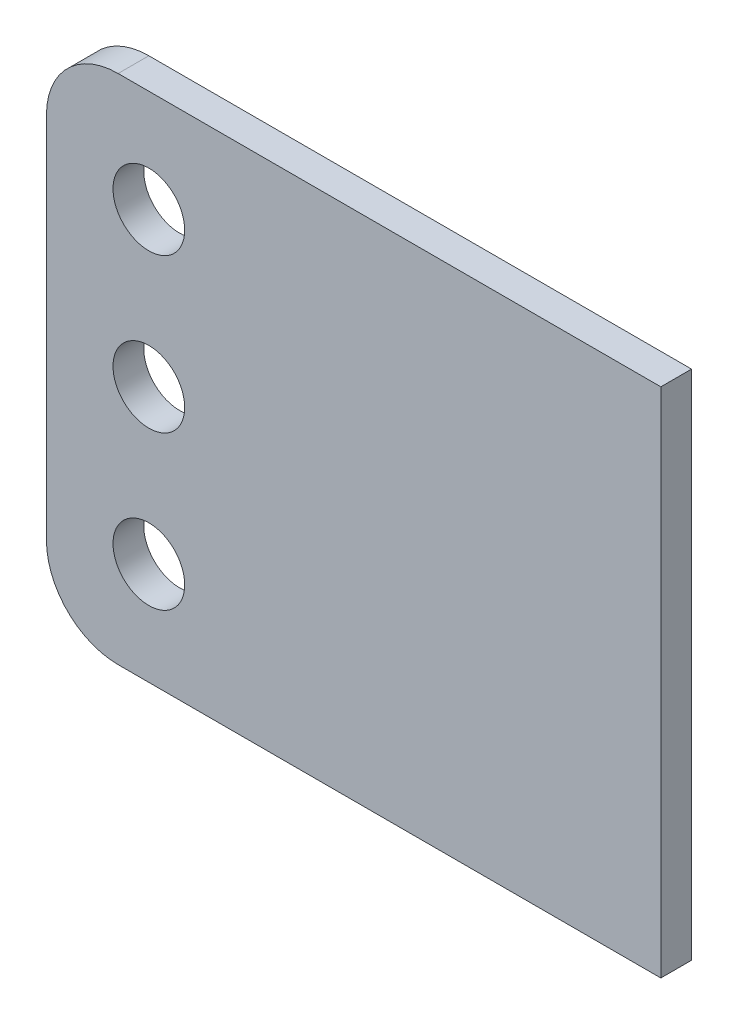
ISO-10303-21;
HEADER;
FILE_DESCRIPTION(('STEP AP214'),'2;1');
FILE_NAME('part.step','',(''),(''),'','','');
FILE_SCHEMA(('AUTOMOTIVE_DESIGN { 1 0 10303 214 1 1 1 1 }'));
ENDSEC;
DATA;
#1=APPLICATION_CONTEXT('core data for automotive mechanical design processes');
#2=APPLICATION_PROTOCOL_DEFINITION('international standard','automotive_design',2000,#1);
#3=PRODUCT_CONTEXT('',#1,'mechanical');
#4=PRODUCT('Part','Part','',(#3));
#5=PRODUCT_RELATED_PRODUCT_CATEGORY('part','',(#4));
#6=PRODUCT_DEFINITION_FORMATION('','',#4);
#7=PRODUCT_DEFINITION_CONTEXT('part definition',#1,'design');
#8=PRODUCT_DEFINITION('design','',#6,#7);
#9=PRODUCT_DEFINITION_SHAPE('','',#8);
#10=(LENGTH_UNIT() NAMED_UNIT(*) SI_UNIT(.MILLI.,.METRE.));
#11=(NAMED_UNIT(*) PLANE_ANGLE_UNIT() SI_UNIT($,.RADIAN.));
#12=(NAMED_UNIT(*) SI_UNIT($,.STERADIAN.) SOLID_ANGLE_UNIT());
#13=UNCERTAINTY_MEASURE_WITH_UNIT(LENGTH_MEASURE(1.E-05),#10,'distance_accuracy_value','');
#14=(GEOMETRIC_REPRESENTATION_CONTEXT(3) GLOBAL_UNCERTAINTY_ASSIGNED_CONTEXT((#13)) GLOBAL_UNIT_ASSIGNED_CONTEXT((#10,
#11,#12)) REPRESENTATION_CONTEXT('',''));
#15=CARTESIAN_POINT('',(0.,0.,0.));
#16=DIRECTION('',(0.,0.,1.));
#17=DIRECTION('',(1.,0.,0.));
#18=AXIS2_PLACEMENT_3D('',#15,#16,#17);
#19=CARTESIAN_POINT('',(0.,0.,3.));
#20=DIRECTION('',(1.,0.,0.));
#21=DIRECTION('',(0.,0.,-1.));
#22=AXIS2_PLACEMENT_3D('',#19,#20,#21);
#23=PLANE('',#22);
#24=DIRECTION('',(0.,-1.,0.));
#25=VECTOR('',#24,1.);
#26=CARTESIAN_POINT('',(0.,0.,0.));
#27=LINE('',#26,#25);
#28=CARTESIAN_POINT('',(0.,43.,0.));
#29=VERTEX_POINT('',#28);
#30=CARTESIAN_POINT('',(0.,7.,0.));
#31=VERTEX_POINT('',#30);
#32=EDGE_CURVE('E126',#29,#31,#27,.T.);
#33=ORIENTED_EDGE('',*,*,#32,.T.);
#34=DIRECTION('',(0.,0.,-1.));
#35=VECTOR('',#34,1.);
#36=CARTESIAN_POINT('',(0.,7.,3.));
#37=LINE('',#36,#35);
#38=CARTESIAN_POINT('',(0.,7.,3.));
#39=VERTEX_POINT('',#38);
#40=EDGE_CURVE('E64',#31,#39,#37,.F.);
#41=ORIENTED_EDGE('',*,*,#40,.T.);
#42=DIRECTION('',(0.,-1.,0.));
#43=VECTOR('',#42,1.);
#44=CARTESIAN_POINT('',(0.,0.,3.));
#45=LINE('',#44,#43);
#46=CARTESIAN_POINT('',(0.,43.,3.));
#47=VERTEX_POINT('',#46);
#48=EDGE_CURVE('E107',#47,#39,#45,.T.);
#49=ORIENTED_EDGE('',*,*,#48,.F.);
#50=DIRECTION('',(0.,0.,-1.));
#51=VECTOR('',#50,1.);
#52=CARTESIAN_POINT('',(0.,43.,3.));
#53=LINE('',#52,#51);
#54=EDGE_CURVE('E140',#47,#29,#53,.T.);
#55=ORIENTED_EDGE('',*,*,#54,.T.);
#56=EDGE_LOOP('',(#33,#41,#49,#55));
#57=FACE_BOUND('',#56,.T.);
#58=ADVANCED_FACE('F43',(#57),#23,.F.);
#59=CARTESIAN_POINT('',(0.,0.,3.));
#60=DIRECTION('',(0.,1.,0.));
#61=DIRECTION('',(0.,0.,1.));
#62=AXIS2_PLACEMENT_3D('',#59,#60,#61);
#63=PLANE('',#62);
#64=DIRECTION('',(1.,0.,0.));
#65=VECTOR('',#64,1.);
#66=CARTESIAN_POINT('',(0.,0.,3.));
#67=LINE('',#66,#65);
#68=CARTESIAN_POINT('',(7.,0.,3.));
#69=VERTEX_POINT('',#68);
#70=CARTESIAN_POINT('',(60.,0.,3.));
#71=VERTEX_POINT('',#70);
#72=EDGE_CURVE('E97',#69,#71,#67,.T.);
#73=ORIENTED_EDGE('',*,*,#72,.F.);
#74=DIRECTION('',(0.,0.,-1.));
#75=VECTOR('',#74,1.);
#76=CARTESIAN_POINT('',(7.,0.,3.));
#77=LINE('',#76,#75);
#78=CARTESIAN_POINT('',(7.,0.,0.));
#79=VERTEX_POINT('',#78);
#80=EDGE_CURVE('E116',#69,#79,#77,.T.);
#81=ORIENTED_EDGE('',*,*,#80,.T.);
#82=DIRECTION('',(1.,0.,0.));
#83=VECTOR('',#82,1.);
#84=CARTESIAN_POINT('',(0.,0.,0.));
#85=LINE('',#84,#83);
#86=CARTESIAN_POINT('',(60.,0.,0.));
#87=VERTEX_POINT('',#86);
#88=EDGE_CURVE('E113',#79,#87,#85,.T.);
#89=ORIENTED_EDGE('',*,*,#88,.T.);
#90=DIRECTION('',(0.,0.,-1.));
#91=VECTOR('',#90,1.);
#92=CARTESIAN_POINT('',(60.,0.,3.));
#93=LINE('',#92,#91);
#94=EDGE_CURVE('E110',#71,#87,#93,.T.);
#95=ORIENTED_EDGE('',*,*,#94,.F.);
#96=EDGE_LOOP('',(#73,#81,#89,#95));
#97=FACE_BOUND('',#96,.T.);
#98=ADVANCED_FACE('F111',(#97),#63,.F.);
#99=CARTESIAN_POINT('',(60.,0.,3.));
#100=DIRECTION('',(-1.,0.,0.));
#101=DIRECTION('',(0.,-1.,0.));
#102=AXIS2_PLACEMENT_3D('',#99,#100,#101);
#103=PLANE('',#102);
#104=DIRECTION('',(0.,1.,0.));
#105=VECTOR('',#104,1.);
#106=CARTESIAN_POINT('',(60.,0.,0.));
#107=LINE('',#106,#105);
#108=CARTESIAN_POINT('',(60.,50.,0.));
#109=VERTEX_POINT('',#108);
#110=EDGE_CURVE('E130',#87,#109,#107,.T.);
#111=ORIENTED_EDGE('',*,*,#110,.T.);
#112=DIRECTION('',(0.,0.,-1.));
#113=VECTOR('',#112,1.);
#114=CARTESIAN_POINT('',(60.,50.,3.));
#115=LINE('',#114,#113);
#116=CARTESIAN_POINT('',(60.,50.,3.));
#117=VERTEX_POINT('',#116);
#118=EDGE_CURVE('E117',#117,#109,#115,.T.);
#119=ORIENTED_EDGE('',*,*,#118,.F.);
#120=DIRECTION('',(0.,1.,0.));
#121=VECTOR('',#120,1.);
#122=CARTESIAN_POINT('',(60.,0.,3.));
#123=LINE('',#122,#121);
#124=EDGE_CURVE('E101',#71,#117,#123,.T.);
#125=ORIENTED_EDGE('',*,*,#124,.F.);
#126=ORIENTED_EDGE('',*,*,#94,.T.);
#127=EDGE_LOOP('',(#111,#119,#125,#126));
#128=FACE_BOUND('',#127,.T.);
#129=ADVANCED_FACE('F119',(#128),#103,.F.);
#130=CARTESIAN_POINT('',(0.,50.,3.));
#131=DIRECTION('',(0.,-1.,0.));
#132=DIRECTION('',(0.,0.,-1.));
#133=AXIS2_PLACEMENT_3D('',#130,#131,#132);
#134=PLANE('',#133);
#135=DIRECTION('',(-1.,0.,0.));
#136=VECTOR('',#135,1.);
#137=CARTESIAN_POINT('',(0.,50.,0.));
#138=LINE('',#137,#136);
#139=CARTESIAN_POINT('',(7.,50.,0.));
#140=VERTEX_POINT('',#139);
#141=EDGE_CURVE('E132',#109,#140,#138,.T.);
#142=ORIENTED_EDGE('',*,*,#141,.T.);
#143=DIRECTION('',(0.,0.,-1.));
#144=VECTOR('',#143,1.);
#145=CARTESIAN_POINT('',(7.,50.,3.));
#146=LINE('',#145,#144);
#147=CARTESIAN_POINT('',(7.,50.,3.));
#148=VERTEX_POINT('',#147);
#149=EDGE_CURVE('E11',#140,#148,#146,.F.);
#150=ORIENTED_EDGE('',*,*,#149,.T.);
#151=DIRECTION('',(-1.,0.,0.));
#152=VECTOR('',#151,1.);
#153=CARTESIAN_POINT('',(0.,50.,3.));
#154=LINE('',#153,#152);
#155=EDGE_CURVE('E121',#117,#148,#154,.T.);
#156=ORIENTED_EDGE('',*,*,#155,.F.);
#157=ORIENTED_EDGE('',*,*,#118,.T.);
#158=EDGE_LOOP('',(#142,#150,#156,#157));
#159=FACE_BOUND('',#158,.T.);
#160=ADVANCED_FACE('F152',(#159),#134,.F.);
#161=CARTESIAN_POINT('',(0.,0.,3.));
#162=DIRECTION('',(0.,0.,-1.));
#163=DIRECTION('',(-1.,0.,0.));
#164=AXIS2_PLACEMENT_3D('',#161,#162,#163);
#165=PLANE('',#164);
#166=CARTESIAN_POINT('',(10.,10.,3.));
#167=DIRECTION('',(0.,0.,1.));
#168=DIRECTION('',(1.,0.,0.));
#169=AXIS2_PLACEMENT_3D('',#166,#167,#168);
#170=CIRCLE('',#169,3.5);
#171=CARTESIAN_POINT('',(13.5,10.,3.));
#172=VERTEX_POINT('',#171);
#173=EDGE_CURVE('E213',#172,#172,#170,.T.);
#174=ORIENTED_EDGE('',*,*,#173,.F.);
#175=EDGE_LOOP('',(#174));
#176=FACE_BOUND('',#175,.T.);
#177=CARTESIAN_POINT('',(10.,25.,3.));
#178=DIRECTION('',(0.,0.,1.));
#179=DIRECTION('',(1.,0.,0.));
#180=AXIS2_PLACEMENT_3D('',#177,#178,#179);
#181=CIRCLE('',#180,3.5);
#182=CARTESIAN_POINT('',(13.5,25.,3.));
#183=VERTEX_POINT('',#182);
#184=EDGE_CURVE('E210',#183,#183,#181,.T.);
#185=ORIENTED_EDGE('',*,*,#184,.F.);
#186=EDGE_LOOP('',(#185));
#187=FACE_BOUND('',#186,.T.);
#188=CARTESIAN_POINT('',(10.,40.,3.));
#189=DIRECTION('',(0.,0.,1.));
#190=DIRECTION('',(1.,0.,0.));
#191=AXIS2_PLACEMENT_3D('',#188,#189,#190);
#192=CIRCLE('',#191,3.5);
#193=CARTESIAN_POINT('',(13.5,40.,3.));
#194=VERTEX_POINT('',#193);
#195=EDGE_CURVE('E204',#194,#194,#192,.T.);
#196=ORIENTED_EDGE('',*,*,#195,.F.);
#197=EDGE_LOOP('',(#196));
#198=FACE_BOUND('',#197,.T.);
#199=ORIENTED_EDGE('',*,*,#48,.T.);
#200=CARTESIAN_POINT('',(7.,7.,3.));
#201=DIRECTION('',(0.,0.,-1.));
#202=DIRECTION('',(-1.,0.,0.));
#203=AXIS2_PLACEMENT_3D('',#200,#201,#202);
#204=CIRCLE('',#203,7.);
#205=EDGE_CURVE('E51',#39,#69,#204,.F.);
#206=ORIENTED_EDGE('',*,*,#205,.T.);
#207=ORIENTED_EDGE('',*,*,#72,.T.);
#208=ORIENTED_EDGE('',*,*,#124,.T.);
#209=ORIENTED_EDGE('',*,*,#155,.T.);
#210=CARTESIAN_POINT('',(7.,43.,3.));
#211=DIRECTION('',(0.,0.,-1.));
#212=DIRECTION('',(-1.,0.,0.));
#213=AXIS2_PLACEMENT_3D('',#210,#211,#212);
#214=CIRCLE('',#213,7.);
#215=EDGE_CURVE('E144',#148,#47,#214,.F.);
#216=ORIENTED_EDGE('',*,*,#215,.T.);
#217=EDGE_LOOP('',(#199,#206,#207,#208,#209,#216));
#218=FACE_BOUND('',#217,.T.);
#219=ADVANCED_FACE('F99',(#176,#187,#198,#218),#165,.F.);
#220=CARTESIAN_POINT('',(0.,0.,0.));
#221=DIRECTION('',(0.,0.,-1.));
#222=DIRECTION('',(-1.,0.,0.));
#223=AXIS2_PLACEMENT_3D('',#220,#221,#222);
#224=PLANE('',#223);
#225=CARTESIAN_POINT('',(10.,10.,0.));
#226=DIRECTION('',(0.,0.,1.));
#227=DIRECTION('',(1.,0.,0.));
#228=AXIS2_PLACEMENT_3D('',#225,#226,#227);
#229=CIRCLE('',#228,3.5);
#230=CARTESIAN_POINT('',(13.5,10.,0.));
#231=VERTEX_POINT('',#230);
#232=EDGE_CURVE('E128',#231,#231,#229,.T.);
#233=ORIENTED_EDGE('',*,*,#232,.T.);
#234=EDGE_LOOP('',(#233));
#235=FACE_BOUND('',#234,.T.);
#236=CARTESIAN_POINT('',(10.,25.,0.));
#237=DIRECTION('',(0.,0.,1.));
#238=DIRECTION('',(1.,0.,0.));
#239=AXIS2_PLACEMENT_3D('',#236,#237,#238);
#240=CIRCLE('',#239,3.5);
#241=CARTESIAN_POINT('',(13.5,25.,0.));
#242=VERTEX_POINT('',#241);
#243=EDGE_CURVE('E200',#242,#242,#240,.T.);
#244=ORIENTED_EDGE('',*,*,#243,.T.);
#245=EDGE_LOOP('',(#244));
#246=FACE_BOUND('',#245,.T.);
#247=CARTESIAN_POINT('',(10.,40.,0.));
#248=DIRECTION('',(0.,0.,1.));
#249=DIRECTION('',(1.,0.,0.));
#250=AXIS2_PLACEMENT_3D('',#247,#248,#249);
#251=CIRCLE('',#250,3.5);
#252=CARTESIAN_POINT('',(13.5,40.,0.));
#253=VERTEX_POINT('',#252);
#254=EDGE_CURVE('E203',#253,#253,#251,.T.);
#255=ORIENTED_EDGE('',*,*,#254,.T.);
#256=EDGE_LOOP('',(#255));
#257=FACE_BOUND('',#256,.T.);
#258=ORIENTED_EDGE('',*,*,#88,.F.);
#259=CARTESIAN_POINT('',(7.,7.,0.));
#260=DIRECTION('',(0.,0.,-1.));
#261=DIRECTION('',(-1.,0.,0.));
#262=AXIS2_PLACEMENT_3D('',#259,#260,#261);
#263=CIRCLE('',#262,7.);
#264=EDGE_CURVE('E138',#79,#31,#263,.T.);
#265=ORIENTED_EDGE('',*,*,#264,.T.);
#266=ORIENTED_EDGE('',*,*,#32,.F.);
#267=CARTESIAN_POINT('',(7.,43.,0.));
#268=DIRECTION('',(0.,0.,-1.));
#269=DIRECTION('',(-1.,0.,0.));
#270=AXIS2_PLACEMENT_3D('',#267,#268,#269);
#271=CIRCLE('',#270,7.);
#272=EDGE_CURVE('E136',#29,#140,#271,.T.);
#273=ORIENTED_EDGE('',*,*,#272,.T.);
#274=ORIENTED_EDGE('',*,*,#141,.F.);
#275=ORIENTED_EDGE('',*,*,#110,.F.);
#276=EDGE_LOOP('',(#258,#265,#266,#273,#274,#275));
#277=FACE_BOUND('',#276,.T.);
#278=ADVANCED_FACE('F151',(#235,#246,#257,#277),#224,.T.);
#279=CARTESIAN_POINT('',(10.,40.,0.));
#280=DIRECTION('',(0.,0.,1.));
#281=DIRECTION('',(1.,0.,0.));
#282=AXIS2_PLACEMENT_3D('',#279,#280,#281);
#283=CYLINDRICAL_SURFACE('',#282,3.5);
#284=ORIENTED_EDGE('',*,*,#254,.F.);
#285=EDGE_LOOP('',(#284));
#286=FACE_BOUND('',#285,.T.);
#287=ORIENTED_EDGE('',*,*,#195,.T.);
#288=EDGE_LOOP('',(#287));
#289=FACE_BOUND('',#288,.T.);
#290=ADVANCED_FACE('F184',(#286,#289),#283,.F.);
#291=CARTESIAN_POINT('',(10.,25.,0.));
#292=DIRECTION('',(0.,0.,1.));
#293=DIRECTION('',(1.,0.,0.));
#294=AXIS2_PLACEMENT_3D('',#291,#292,#293);
#295=CYLINDRICAL_SURFACE('',#294,3.5);
#296=ORIENTED_EDGE('',*,*,#243,.F.);
#297=EDGE_LOOP('',(#296));
#298=FACE_BOUND('',#297,.T.);
#299=ORIENTED_EDGE('',*,*,#184,.T.);
#300=EDGE_LOOP('',(#299));
#301=FACE_BOUND('',#300,.T.);
#302=ADVANCED_FACE('F178',(#298,#301),#295,.F.);
#303=CARTESIAN_POINT('',(10.,10.,0.));
#304=DIRECTION('',(0.,0.,1.));
#305=DIRECTION('',(1.,0.,0.));
#306=AXIS2_PLACEMENT_3D('',#303,#304,#305);
#307=CYLINDRICAL_SURFACE('',#306,3.5);
#308=ORIENTED_EDGE('',*,*,#232,.F.);
#309=EDGE_LOOP('',(#308));
#310=FACE_BOUND('',#309,.T.);
#311=ORIENTED_EDGE('',*,*,#173,.T.);
#312=EDGE_LOOP('',(#311));
#313=FACE_BOUND('',#312,.T.);
#314=ADVANCED_FACE('F172',(#310,#313),#307,.F.);
#315=CARTESIAN_POINT('',(7.,7.,3.));
#316=DIRECTION('',(0.,0.,-1.));
#317=DIRECTION('',(-1.,0.,0.));
#318=AXIS2_PLACEMENT_3D('',#315,#316,#317);
#319=CYLINDRICAL_SURFACE('',#318,7.);
#320=ORIENTED_EDGE('',*,*,#205,.F.);
#321=ORIENTED_EDGE('',*,*,#40,.F.);
#322=ORIENTED_EDGE('',*,*,#264,.F.);
#323=ORIENTED_EDGE('',*,*,#80,.F.);
#324=EDGE_LOOP('',(#320,#321,#322,#323));
#325=FACE_BOUND('',#324,.T.);
#326=ADVANCED_FACE('F170',(#325),#319,.T.);
#327=CARTESIAN_POINT('',(7.,43.,3.));
#328=DIRECTION('',(0.,0.,-1.));
#329=DIRECTION('',(-1.,0.,0.));
#330=AXIS2_PLACEMENT_3D('',#327,#328,#329);
#331=CYLINDRICAL_SURFACE('',#330,7.);
#332=ORIENTED_EDGE('',*,*,#215,.F.);
#333=ORIENTED_EDGE('',*,*,#149,.F.);
#334=ORIENTED_EDGE('',*,*,#272,.F.);
#335=ORIENTED_EDGE('',*,*,#54,.F.);
#336=EDGE_LOOP('',(#332,#333,#334,#335));
#337=FACE_BOUND('',#336,.T.);
#338=ADVANCED_FACE('F45',(#337),#331,.T.);
#339=CLOSED_SHELL('',(#58,#98,#129,#160,#219,#278,#290,#302,#314,#326,#338));
#340=MANIFOLD_SOLID_BREP('B2',#339);
#341=ADVANCED_BREP_SHAPE_REPRESENTATION('',(#18,#340),#14);
#342=SHAPE_DEFINITION_REPRESENTATION(#9,#341);
ENDSEC;
END-ISO-10303-21;
